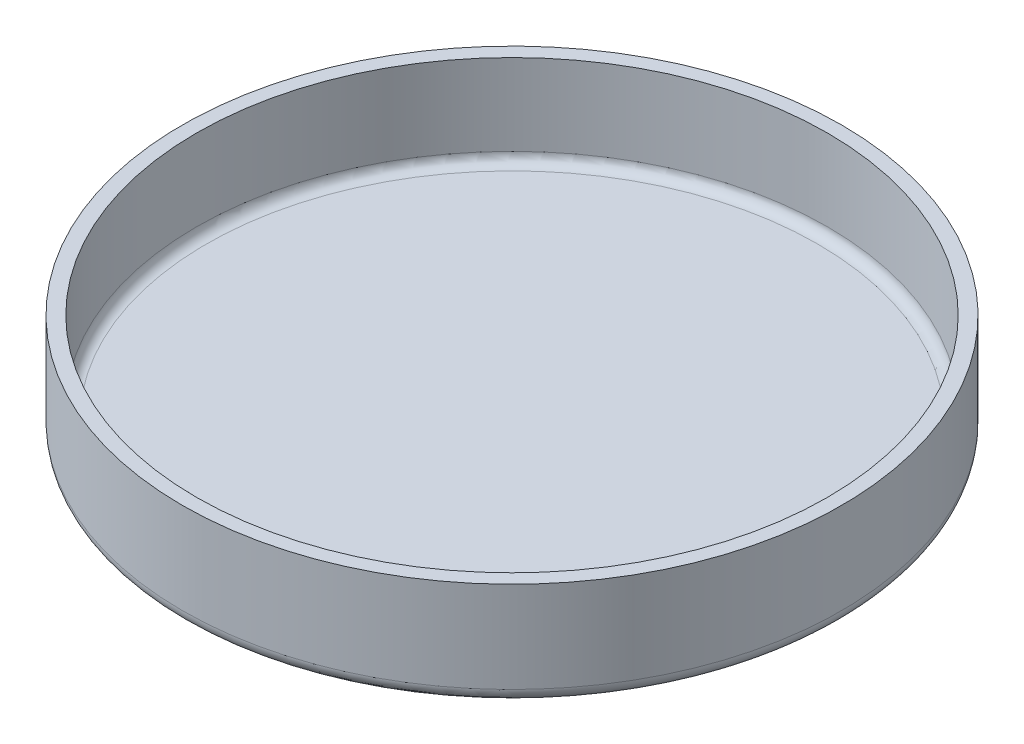
ISO-10303-21;
HEADER;
FILE_DESCRIPTION(('STEP AP214'),'2;1');
FILE_NAME('part.step','',(''),(''),'','','');
FILE_SCHEMA(('AUTOMOTIVE_DESIGN { 1 0 10303 214 1 1 1 1 }'));
ENDSEC;
DATA;
#1=APPLICATION_CONTEXT('core data for automotive mechanical design processes');
#2=APPLICATION_PROTOCOL_DEFINITION('international standard','automotive_design',2000,#1);
#3=PRODUCT_CONTEXT('',#1,'mechanical');
#4=PRODUCT('Part','Part','',(#3));
#5=PRODUCT_RELATED_PRODUCT_CATEGORY('part','',(#4));
#6=PRODUCT_DEFINITION_FORMATION('','',#4);
#7=PRODUCT_DEFINITION_CONTEXT('part definition',#1,'design');
#8=PRODUCT_DEFINITION('design','',#6,#7);
#9=PRODUCT_DEFINITION_SHAPE('','',#8);
#10=(LENGTH_UNIT() NAMED_UNIT(*) SI_UNIT(.MILLI.,.METRE.));
#11=(NAMED_UNIT(*) PLANE_ANGLE_UNIT() SI_UNIT($,.RADIAN.));
#12=(NAMED_UNIT(*) SI_UNIT($,.STERADIAN.) SOLID_ANGLE_UNIT());
#13=UNCERTAINTY_MEASURE_WITH_UNIT(LENGTH_MEASURE(1.E-05),#10,'distance_accuracy_value','');
#14=(GEOMETRIC_REPRESENTATION_CONTEXT(3) GLOBAL_UNCERTAINTY_ASSIGNED_CONTEXT((#13)) GLOBAL_UNIT_ASSIGNED_CONTEXT((#10,
#11,#12)) REPRESENTATION_CONTEXT('',''));
#15=CARTESIAN_POINT('',(0.,0.,0.));
#16=DIRECTION('',(0.,0.,1.));
#17=DIRECTION('',(1.,0.,0.));
#18=AXIS2_PLACEMENT_3D('',#15,#16,#17);
#19=CARTESIAN_POINT('',(0.,2.,0.));
#20=DIRECTION('',(0.,1.,0.));
#21=DIRECTION('',(0.,0.,1.));
#22=AXIS2_PLACEMENT_3D('',#19,#20,#21);
#23=PLANE('',#22);
#24=CARTESIAN_POINT('',(0.,1.99999999999999,0.));
#25=DIRECTION('',(0.,-1.,0.));
#26=DIRECTION('',(0.,0.,-1.));
#27=AXIS2_PLACEMENT_3D('',#24,#25,#26);
#28=CIRCLE('',#27,43.5857864376269);
#29=CARTESIAN_POINT('',(0.,1.99999999999999,-43.5857864376269));
#30=VERTEX_POINT('',#29);
#31=EDGE_CURVE('E10',#30,#30,#28,.T.);
#32=ORIENTED_EDGE('',*,*,#31,.F.);
#33=EDGE_LOOP('',(#32));
#34=FACE_BOUND('',#33,.T.);
#35=ADVANCED_FACE('F30',(#34),#23,.T.);
#36=CARTESIAN_POINT('',(0.,3.41421356237309,0.));
#37=DIRECTION('',(0.,-1.,0.));
#38=DIRECTION('',(0.,0.,-1.));
#39=AXIS2_PLACEMENT_3D('',#36,#37,#38);
#40=TOROIDAL_SURFACE('',#39,43.5857864376269,1.4142135623731);
#41=ORIENTED_EDGE('',*,*,#31,.T.);
#42=EDGE_LOOP('',(#41));
#43=FACE_BOUND('',#42,.T.);
#44=CARTESIAN_POINT('',(0.,3.41421356237309,0.));
#45=DIRECTION('',(0.,-1.,0.));
#46=DIRECTION('',(0.,0.,-1.));
#47=AXIS2_PLACEMENT_3D('',#44,#45,#46);
#48=CIRCLE('',#47,45.);
#49=CARTESIAN_POINT('',(0.,3.41421356237309,-45.));
#50=VERTEX_POINT('',#49);
#51=EDGE_CURVE('E36',#50,#50,#48,.T.);
#52=ORIENTED_EDGE('',*,*,#51,.F.);
#53=EDGE_LOOP('',(#52));
#54=FACE_BOUND('',#53,.T.);
#55=ADVANCED_FACE('F72',(#43,#54),#40,.F.);
#56=CARTESIAN_POINT('',(0.,0.,0.));
#57=DIRECTION('',(0.,-1.,0.));
#58=DIRECTION('',(0.,0.,-1.));
#59=AXIS2_PLACEMENT_3D('',#56,#57,#58);
#60=CYLINDRICAL_SURFACE('',#59,45.);
#61=ORIENTED_EDGE('',*,*,#51,.T.);
#62=EDGE_LOOP('',(#61));
#63=FACE_BOUND('',#62,.T.);
#64=CARTESIAN_POINT('',(0.,15.,0.));
#65=DIRECTION('',(0.,-1.,0.));
#66=DIRECTION('',(0.,0.,-1.));
#67=AXIS2_PLACEMENT_3D('',#64,#65,#66);
#68=CIRCLE('',#67,45.);
#69=CARTESIAN_POINT('',(0.,15.,-45.));
#70=VERTEX_POINT('',#69);
#71=EDGE_CURVE('E40',#70,#70,#68,.T.);
#72=ORIENTED_EDGE('',*,*,#71,.F.);
#73=EDGE_LOOP('',(#72));
#74=FACE_BOUND('',#73,.T.);
#75=ADVANCED_FACE('F77',(#63,#74),#60,.F.);
#76=CARTESIAN_POINT('',(47.,15.,0.));
#77=DIRECTION('',(0.,1.,0.));
#78=DIRECTION('',(0.,0.,1.));
#79=AXIS2_PLACEMENT_3D('',#76,#77,#78);
#80=PLANE('',#79);
#81=ORIENTED_EDGE('',*,*,#71,.T.);
#82=EDGE_LOOP('',(#81));
#83=FACE_BOUND('',#82,.T.);
#84=CARTESIAN_POINT('',(0.,15.,0.));
#85=DIRECTION('',(0.,-1.,0.));
#86=DIRECTION('',(0.,0.,-1.));
#87=AXIS2_PLACEMENT_3D('',#84,#85,#86);
#88=CIRCLE('',#87,47.);
#89=CARTESIAN_POINT('',(0.,15.,-47.));
#90=VERTEX_POINT('',#89);
#91=EDGE_CURVE('E44',#90,#90,#88,.T.);
#92=ORIENTED_EDGE('',*,*,#91,.F.);
#93=EDGE_LOOP('',(#92));
#94=FACE_BOUND('',#93,.T.);
#95=ADVANCED_FACE('F68',(#83,#94),#80,.T.);
#96=CARTESIAN_POINT('',(0.,0.,0.));
#97=DIRECTION('',(0.,-1.,0.));
#98=DIRECTION('',(0.,0.,-1.));
#99=AXIS2_PLACEMENT_3D('',#96,#97,#98);
#100=CYLINDRICAL_SURFACE('',#99,47.);
#101=ORIENTED_EDGE('',*,*,#91,.T.);
#102=EDGE_LOOP('',(#101));
#103=FACE_BOUND('',#102,.T.);
#104=CARTESIAN_POINT('',(0.,2.00000000000001,0.));
#105=DIRECTION('',(0.,-1.,0.));
#106=DIRECTION('',(0.,0.,-1.));
#107=AXIS2_PLACEMENT_3D('',#104,#105,#106);
#108=CIRCLE('',#107,47.);
#109=CARTESIAN_POINT('',(0.,2.00000000000001,-47.));
#110=VERTEX_POINT('',#109);
#111=EDGE_CURVE('E49',#110,#110,#108,.T.);
#112=ORIENTED_EDGE('',*,*,#111,.F.);
#113=EDGE_LOOP('',(#112));
#114=FACE_BOUND('',#113,.T.);
#115=ADVANCED_FACE('F60',(#103,#114),#100,.T.);
#116=CARTESIAN_POINT('',(0.,2.,0.));
#117=DIRECTION('',(0.,-1.,0.));
#118=DIRECTION('',(0.,0.,-1.));
#119=AXIS2_PLACEMENT_3D('',#116,#117,#118);
#120=TOROIDAL_SURFACE('',#119,45.,2.);
#121=ORIENTED_EDGE('',*,*,#111,.T.);
#122=EDGE_LOOP('',(#121));
#123=FACE_BOUND('',#122,.T.);
#124=CARTESIAN_POINT('',(0.,0.,0.));
#125=DIRECTION('',(0.,-1.,0.));
#126=DIRECTION('',(0.,0.,-1.));
#127=AXIS2_PLACEMENT_3D('',#124,#125,#126);
#128=CIRCLE('',#127,45.);
#129=CARTESIAN_POINT('',(0.,0.,-45.));
#130=VERTEX_POINT('',#129);
#131=EDGE_CURVE('E52',#130,#130,#128,.T.);
#132=ORIENTED_EDGE('',*,*,#131,.F.);
#133=EDGE_LOOP('',(#132));
#134=FACE_BOUND('',#133,.T.);
#135=ADVANCED_FACE('F58',(#123,#134),#120,.T.);
#136=CARTESIAN_POINT('',(45.,0.,0.));
#137=DIRECTION('',(0.,-1.,0.));
#138=DIRECTION('',(0.,0.,-1.));
#139=AXIS2_PLACEMENT_3D('',#136,#137,#138);
#140=PLANE('',#139);
#141=ORIENTED_EDGE('',*,*,#131,.T.);
#142=EDGE_LOOP('',(#141));
#143=FACE_BOUND('',#142,.T.);
#144=ADVANCED_FACE('F56',(#143),#140,.T.);
#145=CLOSED_SHELL('',(#35,#55,#75,#95,#115,#135,#144));
#146=MANIFOLD_SOLID_BREP('B2',#145);
#147=ADVANCED_BREP_SHAPE_REPRESENTATION('',(#18,#146),#14);
#148=SHAPE_DEFINITION_REPRESENTATION(#9,#147);
ENDSEC;
END-ISO-10303-21;
